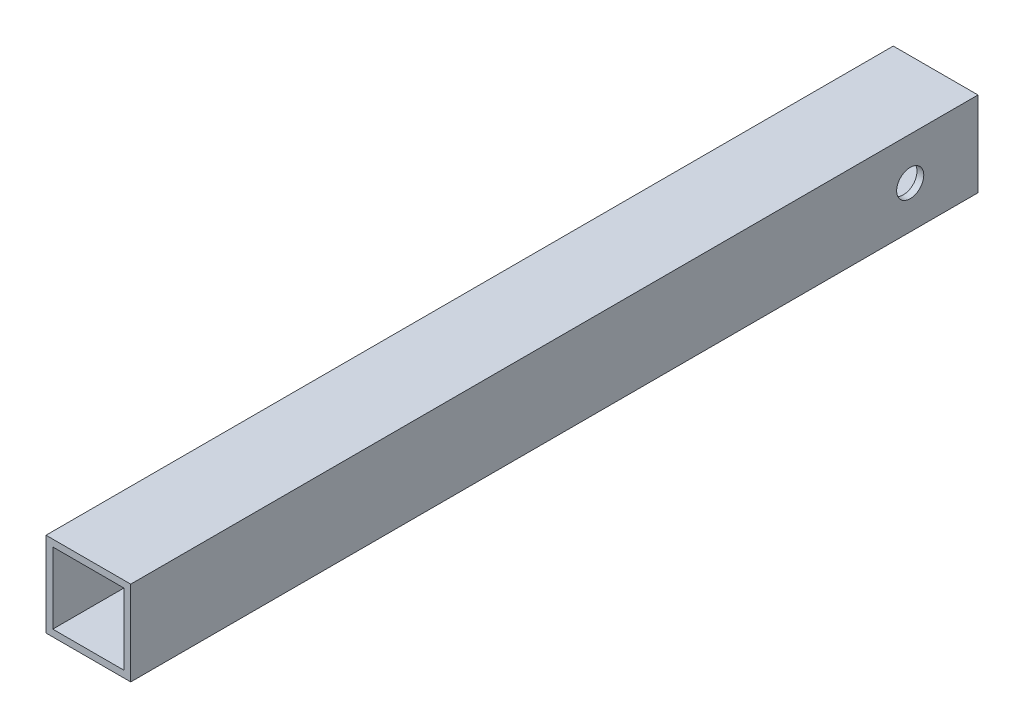
ISO-10303-21;
HEADER;
FILE_DESCRIPTION(('STEP AP214'),'2;1');
FILE_NAME('part.step','',(''),(''),'','','');
FILE_SCHEMA(('AUTOMOTIVE_DESIGN { 1 0 10303 214 1 1 1 1 }'));
ENDSEC;
DATA;
#1=APPLICATION_CONTEXT('core data for automotive mechanical design processes');
#2=APPLICATION_PROTOCOL_DEFINITION('international standard','automotive_design',2000,#1);
#3=PRODUCT_CONTEXT('',#1,'mechanical');
#4=PRODUCT('Part','Part','',(#3));
#5=PRODUCT_RELATED_PRODUCT_CATEGORY('part','',(#4));
#6=PRODUCT_DEFINITION_FORMATION('','',#4);
#7=PRODUCT_DEFINITION_CONTEXT('part definition',#1,'design');
#8=PRODUCT_DEFINITION('design','',#6,#7);
#9=PRODUCT_DEFINITION_SHAPE('','',#8);
#10=(LENGTH_UNIT() NAMED_UNIT(*) SI_UNIT(.MILLI.,.METRE.));
#11=(NAMED_UNIT(*) PLANE_ANGLE_UNIT() SI_UNIT($,.RADIAN.));
#12=(NAMED_UNIT(*) SI_UNIT($,.STERADIAN.) SOLID_ANGLE_UNIT());
#13=UNCERTAINTY_MEASURE_WITH_UNIT(LENGTH_MEASURE(1.E-05),#10,'distance_accuracy_value','');
#14=(GEOMETRIC_REPRESENTATION_CONTEXT(3) GLOBAL_UNCERTAINTY_ASSIGNED_CONTEXT((#13)) GLOBAL_UNIT_ASSIGNED_CONTEXT((#10,
#11,#12)) REPRESENTATION_CONTEXT('',''));
#15=CARTESIAN_POINT('',(0.,0.,0.));
#16=DIRECTION('',(0.,0.,1.));
#17=DIRECTION('',(1.,0.,0.));
#18=AXIS2_PLACEMENT_3D('',#15,#16,#17);
#19=CARTESIAN_POINT('',(0.,0.,125.));
#20=DIRECTION('',(0.,0.,1.));
#21=DIRECTION('',(1.,0.,0.));
#22=AXIS2_PLACEMENT_3D('',#19,#20,#21);
#23=PLANE('',#22);
#24=DIRECTION('',(0.,1.,0.));
#25=VECTOR('',#24,1.);
#26=CARTESIAN_POINT('',(12.5,-12.5,125.));
#27=LINE('',#26,#25);
#28=CARTESIAN_POINT('',(12.5,-12.5,125.));
#29=VERTEX_POINT('',#28);
#30=CARTESIAN_POINT('',(12.5,12.5,125.));
#31=VERTEX_POINT('',#30);
#32=EDGE_CURVE('E162',#29,#31,#27,.T.);
#33=ORIENTED_EDGE('',*,*,#32,.T.);
#34=DIRECTION('',(-1.,0.,0.));
#35=VECTOR('',#34,1.);
#36=CARTESIAN_POINT('',(-12.5,12.5,125.));
#37=LINE('',#36,#35);
#38=CARTESIAN_POINT('',(-12.5,12.5,125.));
#39=VERTEX_POINT('',#38);
#40=EDGE_CURVE('E165',#31,#39,#37,.T.);
#41=ORIENTED_EDGE('',*,*,#40,.T.);
#42=DIRECTION('',(0.,-1.,0.));
#43=VECTOR('',#42,1.);
#44=CARTESIAN_POINT('',(-12.5,-12.5,125.));
#45=LINE('',#44,#43);
#46=CARTESIAN_POINT('',(-12.5,-12.5,125.));
#47=VERTEX_POINT('',#46);
#48=EDGE_CURVE('E168',#39,#47,#45,.T.);
#49=ORIENTED_EDGE('',*,*,#48,.T.);
#50=DIRECTION('',(1.,0.,0.));
#51=VECTOR('',#50,1.);
#52=CARTESIAN_POINT('',(-12.5,-12.5,125.));
#53=LINE('',#52,#51);
#54=EDGE_CURVE('E170',#47,#29,#53,.T.);
#55=ORIENTED_EDGE('',*,*,#54,.T.);
#56=EDGE_LOOP('',(#33,#41,#49,#55));
#57=FACE_BOUND('',#56,.T.);
#58=DIRECTION('',(-1.,0.,0.));
#59=VECTOR('',#58,1.);
#60=CARTESIAN_POINT('',(0.,10.5,125.));
#61=LINE('',#60,#59);
#62=CARTESIAN_POINT('',(10.5,10.5,125.));
#63=VERTEX_POINT('',#62);
#64=CARTESIAN_POINT('',(-10.5,10.5,125.));
#65=VERTEX_POINT('',#64);
#66=EDGE_CURVE('E132',#63,#65,#61,.T.);
#67=ORIENTED_EDGE('',*,*,#66,.F.);
#68=DIRECTION('',(0.,1.,0.));
#69=VECTOR('',#68,1.);
#70=CARTESIAN_POINT('',(10.5,0.,125.));
#71=LINE('',#70,#69);
#72=CARTESIAN_POINT('',(10.5,-10.5,125.));
#73=VERTEX_POINT('',#72);
#74=EDGE_CURVE('E124',#73,#63,#71,.T.);
#75=ORIENTED_EDGE('',*,*,#74,.F.);
#76=DIRECTION('',(1.,0.,0.));
#77=VECTOR('',#76,1.);
#78=CARTESIAN_POINT('',(0.,-10.5,125.));
#79=LINE('',#78,#77);
#80=CARTESIAN_POINT('',(-10.5,-10.5,125.));
#81=VERTEX_POINT('',#80);
#82=EDGE_CURVE('E146',#81,#73,#79,.T.);
#83=ORIENTED_EDGE('',*,*,#82,.F.);
#84=DIRECTION('',(0.,-1.,0.));
#85=VECTOR('',#84,1.);
#86=CARTESIAN_POINT('',(-10.5,0.,125.));
#87=LINE('',#86,#85);
#88=EDGE_CURVE('E144',#65,#81,#87,.T.);
#89=ORIENTED_EDGE('',*,*,#88,.F.);
#90=EDGE_LOOP('',(#67,#75,#83,#89));
#91=FACE_BOUND('',#90,.T.);
#92=ADVANCED_FACE('F58',(#57,#91),#23,.T.);
#93=CARTESIAN_POINT('',(0.,0.,-125.));
#94=DIRECTION('',(0.,0.,1.));
#95=DIRECTION('',(1.,0.,0.));
#96=AXIS2_PLACEMENT_3D('',#93,#94,#95);
#97=PLANE('',#96);
#98=DIRECTION('',(0.,1.,0.));
#99=VECTOR('',#98,1.);
#100=CARTESIAN_POINT('',(12.5,-12.5,-125.));
#101=LINE('',#100,#99);
#102=CARTESIAN_POINT('',(12.5,-12.5,-125.));
#103=VERTEX_POINT('',#102);
#104=CARTESIAN_POINT('',(12.5,12.5,-125.));
#105=VERTEX_POINT('',#104);
#106=EDGE_CURVE('E140',#103,#105,#101,.T.);
#107=ORIENTED_EDGE('',*,*,#106,.F.);
#108=DIRECTION('',(1.,0.,0.));
#109=VECTOR('',#108,1.);
#110=CARTESIAN_POINT('',(-12.5,-12.5,-125.));
#111=LINE('',#110,#109);
#112=CARTESIAN_POINT('',(-12.5,-12.5,-125.));
#113=VERTEX_POINT('',#112);
#114=EDGE_CURVE('E166',#113,#103,#111,.T.);
#115=ORIENTED_EDGE('',*,*,#114,.F.);
#116=DIRECTION('',(0.,-1.,0.));
#117=VECTOR('',#116,1.);
#118=CARTESIAN_POINT('',(-12.5,-12.5,-125.));
#119=LINE('',#118,#117);
#120=CARTESIAN_POINT('',(-12.5,12.5,-125.));
#121=VERTEX_POINT('',#120);
#122=EDGE_CURVE('E177',#121,#113,#119,.T.);
#123=ORIENTED_EDGE('',*,*,#122,.F.);
#124=DIRECTION('',(-1.,0.,0.));
#125=VECTOR('',#124,1.);
#126=CARTESIAN_POINT('',(-12.5,12.5,-125.));
#127=LINE('',#126,#125);
#128=EDGE_CURVE('E175',#105,#121,#127,.T.);
#129=ORIENTED_EDGE('',*,*,#128,.F.);
#130=EDGE_LOOP('',(#107,#115,#123,#129));
#131=FACE_BOUND('',#130,.T.);
#132=DIRECTION('',(0.,1.,0.));
#133=VECTOR('',#132,1.);
#134=CARTESIAN_POINT('',(10.5,0.,-125.));
#135=LINE('',#134,#133);
#136=CARTESIAN_POINT('',(10.5,-10.5,-125.));
#137=VERTEX_POINT('',#136);
#138=CARTESIAN_POINT('',(10.5,10.5,-125.));
#139=VERTEX_POINT('',#138);
#140=EDGE_CURVE('E82',#137,#139,#135,.T.);
#141=ORIENTED_EDGE('',*,*,#140,.T.);
#142=DIRECTION('',(-1.,0.,0.));
#143=VECTOR('',#142,1.);
#144=CARTESIAN_POINT('',(0.,10.5,-125.));
#145=LINE('',#144,#143);
#146=CARTESIAN_POINT('',(-10.5,10.5,-125.));
#147=VERTEX_POINT('',#146);
#148=EDGE_CURVE('E139',#139,#147,#145,.T.);
#149=ORIENTED_EDGE('',*,*,#148,.T.);
#150=DIRECTION('',(0.,-1.,0.));
#151=VECTOR('',#150,1.);
#152=CARTESIAN_POINT('',(-10.5,0.,-125.));
#153=LINE('',#152,#151);
#154=CARTESIAN_POINT('',(-10.5,-10.5,-125.));
#155=VERTEX_POINT('',#154);
#156=EDGE_CURVE('E154',#147,#155,#153,.T.);
#157=ORIENTED_EDGE('',*,*,#156,.T.);
#158=DIRECTION('',(1.,0.,0.));
#159=VECTOR('',#158,1.);
#160=CARTESIAN_POINT('',(0.,-10.5,-125.));
#161=LINE('',#160,#159);
#162=EDGE_CURVE('E133',#155,#137,#161,.T.);
#163=ORIENTED_EDGE('',*,*,#162,.T.);
#164=EDGE_LOOP('',(#141,#149,#157,#163));
#165=FACE_BOUND('',#164,.T.);
#166=ADVANCED_FACE('F196',(#131,#165),#97,.F.);
#167=CARTESIAN_POINT('',(12.5,-12.5,125.));
#168=DIRECTION('',(-1.,0.,0.));
#169=DIRECTION('',(0.,0.,1.));
#170=AXIS2_PLACEMENT_3D('',#167,#168,#169);
#171=PLANE('',#170);
#172=CARTESIAN_POINT('',(12.5,0.,-105.));
#173=DIRECTION('',(1.,0.,0.));
#174=DIRECTION('',(0.,0.,-1.));
#175=AXIS2_PLACEMENT_3D('',#172,#173,#174);
#176=CIRCLE('',#175,3.99999999999999);
#177=CARTESIAN_POINT('',(12.5,0.,-109.));
#178=VERTEX_POINT('',#177);
#179=EDGE_CURVE('E239',#178,#178,#176,.T.);
#180=ORIENTED_EDGE('',*,*,#179,.F.);
#181=EDGE_LOOP('',(#180));
#182=FACE_BOUND('',#181,.T.);
#183=ORIENTED_EDGE('',*,*,#106,.T.);
#184=DIRECTION('',(0.,0.,-1.));
#185=VECTOR('',#184,1.);
#186=CARTESIAN_POINT('',(12.5,12.5,125.));
#187=LINE('',#186,#185);
#188=EDGE_CURVE('E12',#31,#105,#187,.T.);
#189=ORIENTED_EDGE('',*,*,#188,.F.);
#190=ORIENTED_EDGE('',*,*,#32,.F.);
#191=DIRECTION('',(0.,0.,-1.));
#192=VECTOR('',#191,1.);
#193=CARTESIAN_POINT('',(12.5,-12.5,125.));
#194=LINE('',#193,#192);
#195=EDGE_CURVE('E172',#29,#103,#194,.T.);
#196=ORIENTED_EDGE('',*,*,#195,.T.);
#197=EDGE_LOOP('',(#183,#189,#190,#196));
#198=FACE_BOUND('',#197,.T.);
#199=ADVANCED_FACE('F60',(#182,#198),#171,.F.);
#200=CARTESIAN_POINT('',(-12.5,12.5,125.));
#201=DIRECTION('',(0.,-1.,0.));
#202=DIRECTION('',(0.,0.,-1.));
#203=AXIS2_PLACEMENT_3D('',#200,#201,#202);
#204=PLANE('',#203);
#205=ORIENTED_EDGE('',*,*,#128,.T.);
#206=DIRECTION('',(0.,0.,-1.));
#207=VECTOR('',#206,1.);
#208=CARTESIAN_POINT('',(-12.5,12.5,125.));
#209=LINE('',#208,#207);
#210=EDGE_CURVE('E67',#39,#121,#209,.T.);
#211=ORIENTED_EDGE('',*,*,#210,.F.);
#212=ORIENTED_EDGE('',*,*,#40,.F.);
#213=ORIENTED_EDGE('',*,*,#188,.T.);
#214=EDGE_LOOP('',(#205,#211,#212,#213));
#215=FACE_BOUND('',#214,.T.);
#216=ADVANCED_FACE('F206',(#215),#204,.F.);
#217=CARTESIAN_POINT('',(-12.5,-12.5,125.));
#218=DIRECTION('',(1.,0.,0.));
#219=DIRECTION('',(0.,0.,-1.));
#220=AXIS2_PLACEMENT_3D('',#217,#218,#219);
#221=PLANE('',#220);
#222=CARTESIAN_POINT('',(-12.5,0.,-105.));
#223=DIRECTION('',(1.,0.,0.));
#224=DIRECTION('',(0.,0.,-1.));
#225=AXIS2_PLACEMENT_3D('',#222,#223,#224);
#226=CIRCLE('',#225,3.99999999999999);
#227=CARTESIAN_POINT('',(-12.5,0.,-109.));
#228=VERTEX_POINT('',#227);
#229=EDGE_CURVE('E237',#228,#228,#226,.T.);
#230=ORIENTED_EDGE('',*,*,#229,.T.);
#231=EDGE_LOOP('',(#230));
#232=FACE_BOUND('',#231,.T.);
#233=ORIENTED_EDGE('',*,*,#122,.T.);
#234=DIRECTION('',(0.,0.,-1.));
#235=VECTOR('',#234,1.);
#236=CARTESIAN_POINT('',(-12.5,-12.5,125.));
#237=LINE('',#236,#235);
#238=EDGE_CURVE('E182',#47,#113,#237,.T.);
#239=ORIENTED_EDGE('',*,*,#238,.F.);
#240=ORIENTED_EDGE('',*,*,#48,.F.);
#241=ORIENTED_EDGE('',*,*,#210,.T.);
#242=EDGE_LOOP('',(#233,#239,#240,#241));
#243=FACE_BOUND('',#242,.T.);
#244=ADVANCED_FACE('F190',(#232,#243),#221,.F.);
#245=CARTESIAN_POINT('',(-12.5,-12.5,125.));
#246=DIRECTION('',(0.,1.,0.));
#247=DIRECTION('',(0.,0.,1.));
#248=AXIS2_PLACEMENT_3D('',#245,#246,#247);
#249=PLANE('',#248);
#250=ORIENTED_EDGE('',*,*,#114,.T.);
#251=ORIENTED_EDGE('',*,*,#195,.F.);
#252=ORIENTED_EDGE('',*,*,#54,.F.);
#253=ORIENTED_EDGE('',*,*,#238,.T.);
#254=EDGE_LOOP('',(#250,#251,#252,#253));
#255=FACE_BOUND('',#254,.T.);
#256=ADVANCED_FACE('F200',(#255),#249,.F.);
#257=CARTESIAN_POINT('',(10.5,0.,125.));
#258=DIRECTION('',(-1.,0.,0.));
#259=DIRECTION('',(0.,0.,1.));
#260=AXIS2_PLACEMENT_3D('',#257,#258,#259);
#261=PLANE('',#260);
#262=CARTESIAN_POINT('',(10.5,0.,-105.));
#263=DIRECTION('',(-1.,0.,0.));
#264=DIRECTION('',(0.,0.,1.));
#265=AXIS2_PLACEMENT_3D('',#262,#263,#264);
#266=CIRCLE('',#265,3.99999999999999);
#267=CARTESIAN_POINT('',(10.5,0.,-101.));
#268=VERTEX_POINT('',#267);
#269=EDGE_CURVE('E152',#268,#268,#266,.T.);
#270=ORIENTED_EDGE('',*,*,#269,.F.);
#271=EDGE_LOOP('',(#270));
#272=FACE_BOUND('',#271,.T.);
#273=ORIENTED_EDGE('',*,*,#140,.F.);
#274=DIRECTION('',(0.,0.,-1.));
#275=VECTOR('',#274,1.);
#276=CARTESIAN_POINT('',(10.5,-10.5,125.));
#277=LINE('',#276,#275);
#278=EDGE_CURVE('E128',#73,#137,#277,.T.);
#279=ORIENTED_EDGE('',*,*,#278,.F.);
#280=ORIENTED_EDGE('',*,*,#74,.T.);
#281=DIRECTION('',(0.,0.,-1.));
#282=VECTOR('',#281,1.);
#283=CARTESIAN_POINT('',(10.5,10.5,125.));
#284=LINE('',#283,#282);
#285=EDGE_CURVE('E127',#63,#139,#284,.T.);
#286=ORIENTED_EDGE('',*,*,#285,.T.);
#287=EDGE_LOOP('',(#273,#279,#280,#286));
#288=FACE_BOUND('',#287,.T.);
#289=ADVANCED_FACE('F126',(#272,#288),#261,.T.);
#290=CARTESIAN_POINT('',(0.,10.5,125.));
#291=DIRECTION('',(0.,-1.,0.));
#292=DIRECTION('',(0.,0.,-1.));
#293=AXIS2_PLACEMENT_3D('',#290,#291,#292);
#294=PLANE('',#293);
#295=ORIENTED_EDGE('',*,*,#148,.F.);
#296=ORIENTED_EDGE('',*,*,#285,.F.);
#297=ORIENTED_EDGE('',*,*,#66,.T.);
#298=DIRECTION('',(0.,0.,-1.));
#299=VECTOR('',#298,1.);
#300=CARTESIAN_POINT('',(-10.5,10.5,125.));
#301=LINE('',#300,#299);
#302=EDGE_CURVE('E141',#65,#147,#301,.T.);
#303=ORIENTED_EDGE('',*,*,#302,.T.);
#304=EDGE_LOOP('',(#295,#296,#297,#303));
#305=FACE_BOUND('',#304,.T.);
#306=ADVANCED_FACE('F136',(#305),#294,.T.);
#307=CARTESIAN_POINT('',(-10.5,0.,125.));
#308=DIRECTION('',(1.,0.,0.));
#309=DIRECTION('',(0.,0.,-1.));
#310=AXIS2_PLACEMENT_3D('',#307,#308,#309);
#311=PLANE('',#310);
#312=CARTESIAN_POINT('',(-10.5,0.,-105.));
#313=DIRECTION('',(1.,0.,0.));
#314=DIRECTION('',(0.,0.,-1.));
#315=AXIS2_PLACEMENT_3D('',#312,#313,#314);
#316=CIRCLE('',#315,3.99999999999999);
#317=CARTESIAN_POINT('',(-10.5,0.,-109.));
#318=VERTEX_POINT('',#317);
#319=EDGE_CURVE('E62',#318,#318,#316,.T.);
#320=ORIENTED_EDGE('',*,*,#319,.F.);
#321=EDGE_LOOP('',(#320));
#322=FACE_BOUND('',#321,.T.);
#323=ORIENTED_EDGE('',*,*,#156,.F.);
#324=ORIENTED_EDGE('',*,*,#302,.F.);
#325=ORIENTED_EDGE('',*,*,#88,.T.);
#326=DIRECTION('',(0.,0.,-1.));
#327=VECTOR('',#326,1.);
#328=CARTESIAN_POINT('',(-10.5,-10.5,125.));
#329=LINE('',#328,#327);
#330=EDGE_CURVE('E74',#81,#155,#329,.T.);
#331=ORIENTED_EDGE('',*,*,#330,.T.);
#332=EDGE_LOOP('',(#323,#324,#325,#331));
#333=FACE_BOUND('',#332,.T.);
#334=ADVANCED_FACE('F232',(#322,#333),#311,.T.);
#335=CARTESIAN_POINT('',(0.,-10.5,125.));
#336=DIRECTION('',(0.,1.,0.));
#337=DIRECTION('',(0.,0.,1.));
#338=AXIS2_PLACEMENT_3D('',#335,#336,#337);
#339=PLANE('',#338);
#340=ORIENTED_EDGE('',*,*,#162,.F.);
#341=ORIENTED_EDGE('',*,*,#330,.F.);
#342=ORIENTED_EDGE('',*,*,#82,.T.);
#343=ORIENTED_EDGE('',*,*,#278,.T.);
#344=EDGE_LOOP('',(#340,#341,#342,#343));
#345=FACE_BOUND('',#344,.T.);
#346=ADVANCED_FACE('F248',(#345),#339,.T.);
#347=CARTESIAN_POINT('',(-12.5,0.,-105.));
#348=DIRECTION('',(1.,0.,0.));
#349=DIRECTION('',(0.,0.,-1.));
#350=AXIS2_PLACEMENT_3D('',#347,#348,#349);
#351=CYLINDRICAL_SURFACE('',#350,3.99999999999999);
#352=ORIENTED_EDGE('',*,*,#319,.T.);
#353=EDGE_LOOP('',(#352));
#354=FACE_BOUND('',#353,.T.);
#355=ORIENTED_EDGE('',*,*,#229,.F.);
#356=EDGE_LOOP('',(#355));
#357=FACE_BOUND('',#356,.T.);
#358=ADVANCED_FACE('F245',(#354,#357),#351,.F.);
#359=ORIENTED_EDGE('',*,*,#269,.T.);
#360=EDGE_LOOP('',(#359));
#361=FACE_BOUND('',#360,.T.);
#362=ORIENTED_EDGE('',*,*,#179,.T.);
#363=EDGE_LOOP('',(#362));
#364=FACE_BOUND('',#363,.T.);
#365=ADVANCED_FACE('F247',(#361,#364),#351,.F.);
#366=CLOSED_SHELL('',(#92,#166,#199,#216,#244,#256,#289,#306,#334,#346,#358,#365));
#367=MANIFOLD_SOLID_BREP('B2',#366);
#368=ADVANCED_BREP_SHAPE_REPRESENTATION('',(#18,#367),#14);
#369=SHAPE_DEFINITION_REPRESENTATION(#9,#368);
ENDSEC;
END-ISO-10303-21;
